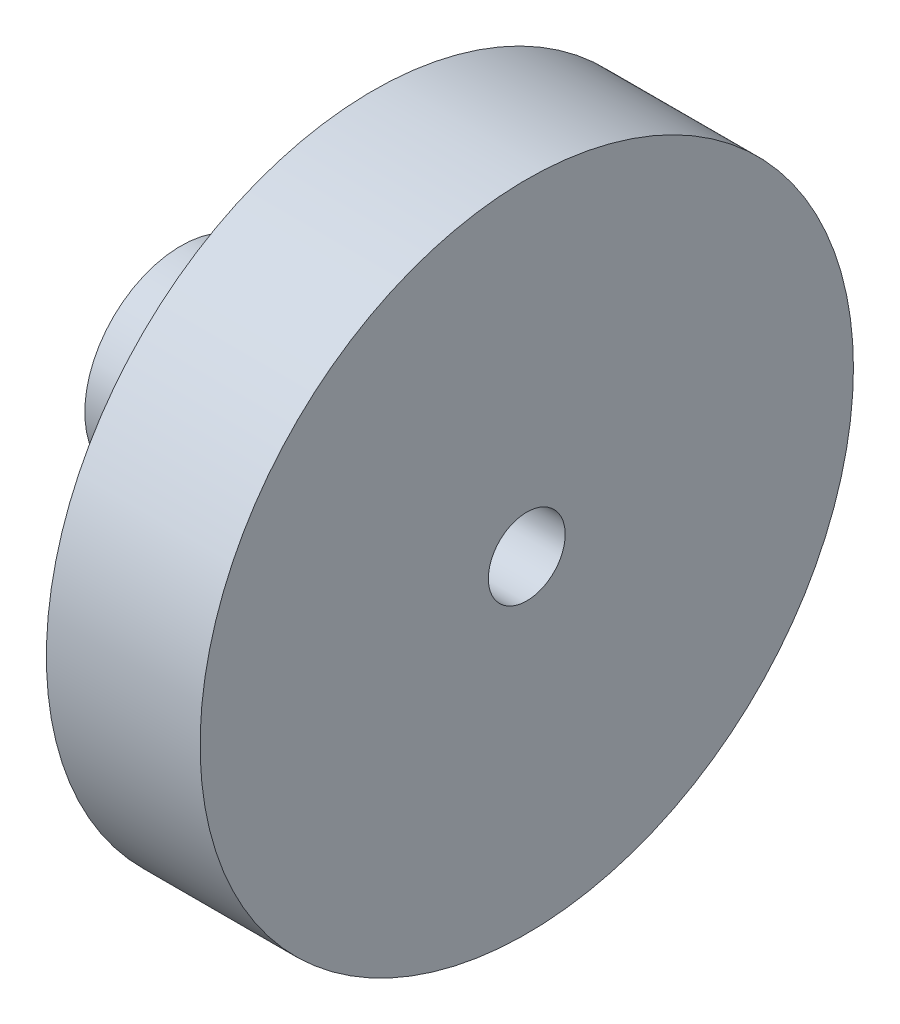
ISO-10303-21;
HEADER;
FILE_DESCRIPTION(('STEP AP214'),'2;1');
FILE_NAME('part.step','',(''),(''),'','','');
FILE_SCHEMA(('AUTOMOTIVE_DESIGN { 1 0 10303 214 1 1 1 1 }'));
ENDSEC;
DATA;
#1=APPLICATION_CONTEXT('core data for automotive mechanical design processes');
#2=APPLICATION_PROTOCOL_DEFINITION('international standard','automotive_design',2000,#1);
#3=PRODUCT_CONTEXT('',#1,'mechanical');
#4=PRODUCT('Part','Part','',(#3));
#5=PRODUCT_RELATED_PRODUCT_CATEGORY('part','',(#4));
#6=PRODUCT_DEFINITION_FORMATION('','',#4);
#7=PRODUCT_DEFINITION_CONTEXT('part definition',#1,'design');
#8=PRODUCT_DEFINITION('design','',#6,#7);
#9=PRODUCT_DEFINITION_SHAPE('','',#8);
#10=(LENGTH_UNIT() NAMED_UNIT(*) SI_UNIT(.MILLI.,.METRE.));
#11=(NAMED_UNIT(*) PLANE_ANGLE_UNIT() SI_UNIT($,.RADIAN.));
#12=(NAMED_UNIT(*) SI_UNIT($,.STERADIAN.) SOLID_ANGLE_UNIT());
#13=UNCERTAINTY_MEASURE_WITH_UNIT(LENGTH_MEASURE(1.E-05),#10,'distance_accuracy_value','');
#14=(GEOMETRIC_REPRESENTATION_CONTEXT(3) GLOBAL_UNCERTAINTY_ASSIGNED_CONTEXT((#13)) GLOBAL_UNIT_ASSIGNED_CONTEXT((#10,
#11,#12)) REPRESENTATION_CONTEXT('',''));
#15=CARTESIAN_POINT('',(0.,0.,0.));
#16=DIRECTION('',(0.,0.,1.));
#17=DIRECTION('',(1.,0.,0.));
#18=AXIS2_PLACEMENT_3D('',#15,#16,#17);
#19=CARTESIAN_POINT('',(0.,0.,0.));
#20=DIRECTION('',(1.,0.,0.));
#21=DIRECTION('',(0.,0.,-1.));
#22=AXIS2_PLACEMENT_3D('',#19,#20,#21);
#23=CYLINDRICAL_SURFACE('',#22,1.99999999999999);
#24=CARTESIAN_POINT('',(-13.45322017837,1.79843682124226,0.874999999999999));
#25=CARTESIAN_POINT('',(-13.4996455668491,1.79844267025872,0.874994185373086));
#26=CARTESIAN_POINT('',(-13.5461362263386,1.80026089575614,0.871281814553723));
#27=CARTESIAN_POINT('',(-13.6377609995906,1.80729814585877,0.856583265673776));
#28=CARTESIAN_POINT('',(-13.6828912938866,1.81252595391355,0.84557829993033));
#29=CARTESIAN_POINT('',(-13.7702976402033,1.8256650779135,0.816819377461344));
#30=CARTESIAN_POINT('',(-13.8125852056156,1.8335646755163,0.799094852047655));
#31=CARTESIAN_POINT('',(-13.8935757385446,1.85114060751144,0.757486974078159));
#32=CARTESIAN_POINT('',(-13.9322792980636,1.86081664768249,0.73360464113771));
#33=CARTESIAN_POINT('',(-14.0076858180357,1.88159814273405,0.67860444231314));
#34=CARTESIAN_POINT('',(-14.0441131990626,1.89275511820233,0.647128046535023));
#35=CARTESIAN_POINT('',(-14.1113783929879,1.91482009276172,0.578584404393027));
#36=CARTESIAN_POINT('',(-14.142213918134,1.92572798836067,0.54151488106822));
#37=CARTESIAN_POINT('',(-14.1988776130539,1.94670307260467,0.460623507148396));
#38=CARTESIAN_POINT('',(-14.2243889001395,1.95670347428988,0.41656077793032));
#39=CARTESIAN_POINT('',(-14.2675157518473,1.97409759337225,0.324251594935387));
#40=CARTESIAN_POINT('',(-14.2851351629206,1.98149258025648,0.276007192994719));
#41=CARTESIAN_POINT('',(-14.3109580815994,1.99247601660861,0.179604041111906));
#42=CARTESIAN_POINT('',(-14.319638658996,1.99625645567351,0.131595413599112));
#43=CARTESIAN_POINT('',(-14.3288859892659,2.00028676065695,0.0346643937267909));
#44=CARTESIAN_POINT('',(-14.3294563937463,2.00053821550072,-0.0142575774637081));
#45=CARTESIAN_POINT('',(-14.3227019762157,1.99759023252614,-0.108130873463996));
#46=CARTESIAN_POINT('',(-14.3159033487893,1.99462077737978,-0.153128695211823));
#47=CARTESIAN_POINT('',(-14.295515053418,1.98588800112158,-0.241269408956307));
#48=CARTESIAN_POINT('',(-14.2819248829422,1.98012447326713,-0.284412163433232));
#49=CARTESIAN_POINT('',(-14.2481883972403,1.96624268291741,-0.368417631333126));
#50=CARTESIAN_POINT('',(-14.2279450345039,1.95808977061224,-0.409235407844303));
#51=CARTESIAN_POINT('',(-14.1815782919894,1.94021222057016,-0.487002053634942));
#52=CARTESIAN_POINT('',(-14.1554527802275,1.93048701331643,-0.523949512986161));
#53=CARTESIAN_POINT('',(-14.095743534564,1.90954741359336,-0.595935871549107));
#54=CARTESIAN_POINT('',(-14.0617419102102,1.89827601276047,-0.630612038356138));
#55=CARTESIAN_POINT('',(-13.9884073903243,1.87605441136165,-0.693936886024361));
#56=CARTESIAN_POINT('',(-13.9490720130834,1.86510436321814,-0.722582745149668));
#57=CARTESIAN_POINT('',(-13.8642488780768,1.84433360774734,-0.774104007572307));
#58=CARTESIAN_POINT('',(-13.8185799874721,1.83457425910816,-0.796708133338992));
#59=CARTESIAN_POINT('',(-13.7235451295974,1.81804057215013,-0.833753424928245));
#60=CARTESIAN_POINT('',(-13.6741821543204,1.81126384804948,-0.848201117652945));
#61=CARTESIAN_POINT('',(-13.5768048279816,1.8020725724064,-0.86754954409033));
#62=CARTESIAN_POINT('',(-13.5289342267471,1.79938817756936,-0.873042695282303));
#63=CARTESIAN_POINT('',(-13.4328901766476,1.79791183626622,-0.876080687797387));
#64=CARTESIAN_POINT('',(-13.3847168599139,1.79911829529383,-0.873628785071821));
#65=CARTESIAN_POINT('',(-13.2931886211794,1.80500670942424,-0.861388170364229));
#66=CARTESIAN_POINT('',(-13.249740356961,1.80942578993547,-0.85215387305427));
#67=CARTESIAN_POINT('',(-13.1650554737938,1.82089297578771,-0.827365600067959));
#68=CARTESIAN_POINT('',(-13.1238194113395,1.82794173912936,-0.81181004259548));
#69=CARTESIAN_POINT('',(-13.0426847429497,1.84425139082008,-0.774064553531829));
#70=CARTESIAN_POINT('',(-13.0029259532811,1.85359632906455,-0.751611624558049));
#71=CARTESIAN_POINT('',(-12.9275374391374,1.87333686493426,-0.700961597965227));
#72=CARTESIAN_POINT('',(-12.8919096333482,1.88373294661273,-0.67276184779974));
#73=CARTESIAN_POINT('',(-12.8223972844785,1.9055511022817,-0.608384071274641));
#74=CARTESIAN_POINT('',(-12.7889703773977,1.91698003267099,-0.571712181701362));
#75=CARTESIAN_POINT('',(-12.7286480364516,1.93870750509733,-0.493028918701698));
#76=CARTESIAN_POINT('',(-12.7017534029818,1.94900590852694,-0.451016891911296));
#77=CARTESIAN_POINT('',(-12.6551778658299,1.96743104077039,-0.36232293883673));
#78=CARTESIAN_POINT('',(-12.6355478993033,1.97554233072842,-0.315610854101785));
#79=CARTESIAN_POINT('',(-12.6045830029,1.98855746644758,-0.219097297225345));
#80=CARTESIAN_POINT('',(-12.5932425737112,1.99346343839954,-0.169297897056046));
#81=CARTESIAN_POINT('',(-12.5799216972897,1.9992481211277,-0.07209118045084));
#82=CARTESIAN_POINT('',(-12.5772979505768,2.00040346809815,-0.0247879798759334));
#83=CARTESIAN_POINT('',(-12.5797156890887,1.99934575386789,0.0695781809476551));
#84=CARTESIAN_POINT('',(-12.5847555731484,1.99713339628286,0.116641189318635));
#85=CARTESIAN_POINT('',(-12.6018970800604,1.98974125718853,0.207139588656076));
#86=CARTESIAN_POINT('',(-12.6136929883777,1.98469010746016,0.250644310304771));
#87=CARTESIAN_POINT('',(-12.6436605807471,1.97220099963069,0.335028608079217));
#88=CARTESIAN_POINT('',(-12.66183340789,1.96476261362741,0.375907711996158));
#89=CARTESIAN_POINT('',(-12.7049588556092,1.94778329676525,0.455950413510898));
#90=CARTESIAN_POINT('',(-12.7301838494413,1.93816167830775,0.494949713940653));
#91=CARTESIAN_POINT('',(-12.7863173209961,1.9179284324557,0.568332496894421));
#92=CARTESIAN_POINT('',(-12.8172281396271,1.90731639818727,0.602714068131048));
#93=CARTESIAN_POINT('',(-12.8866180691496,1.8852720278619,0.668615771310957));
#94=CARTESIAN_POINT('',(-12.92549407957,1.87383871323809,0.699719139890721));
#95=CARTESIAN_POINT('',(-13.008235966694,1.85224037393765,0.755043607534097));
#96=CARTESIAN_POINT('',(-13.0521048360146,1.84207611764286,0.779260548271213));
#97=CARTESIAN_POINT('',(-13.1438407753336,1.82429849284974,0.820019671710732));
#98=CARTESIAN_POINT('',(-13.1917127591117,1.81668831862308,0.836552253811327));
#99=CARTESIAN_POINT('',(-13.2899205481475,1.80518424635639,0.861104681242927));
#100=CARTESIAN_POINT('',(-13.3402474868291,1.80127788482797,0.869153086488734));
#101=CARTESIAN_POINT('',(-13.4116225729651,1.79879556732175,0.874260805643789));
#102=CARTESIAN_POINT('',(-13.4324148213181,1.79843420002831,0.875002605802406));
#103=CARTESIAN_POINT('',(-13.45322017837,1.79843682124226,0.874999999999999));
#104=B_SPLINE_CURVE_WITH_KNOTS('',3,(#24,#25,#26,#27,#28,#29,#30,#31,#32,#33,#34,#35,#36,#37,
#38,#39,#40,#41,#42,#43,#44,#45,#46,#47,#48,#49,#50,#51,#52,#53,#54,#55,#56,#57,#58,#59,#60,#61,
#62,#63,#64,#65,#66,#67,#68,#69,#70,#71,#72,#73,#74,#75,#76,#77,#78,#79,#80,#81,#82,#83,#84,#85,
#86,#87,#88,#89,#90,#91,#92,#93,#94,#95,#96,#97,#98,#99,#100,#101,#102,#103),.UNSPECIFIED.,.T.,
.F.,(4,2,2,2,2,2,2,2,2,2,2,2,2,2,2,2,2,2,2,2,2,2,2,2,2,2,2,2,2,2,2,2,2,2,2,2,2,2,2,4),(0.,
0.139211854544829,0.278783757833573,0.417751277057172,0.556695800673241,0.704311269509711,
0.851986995525496,1.00685254156655,1.16164252475057,1.30765941027075,1.45361054957448,
1.58978716337857,1.72597385487562,1.86424242444373,2.00256119034027,2.1514705177321,
2.30044936949917,2.45528783220658,2.61000221454627,2.75399082716966,2.89792043948698,
3.03123544972419,3.16458384051276,3.30382998316913,3.44314054349794,3.5951953656407,
3.74726880958002,3.90038919363012,4.0534079045894,4.19484840308351,4.33625935442152,
4.47172667892147,4.60721829895103,4.74891487272681,4.8906699154392,5.04321071182055,
5.19584342435713,5.34866632230719,5.50097312018721,5.56336037066704),.UNSPECIFIED.);
#105=CARTESIAN_POINT('',(-13.45322017837,1.79843682124226,0.874999999999999));
#106=VERTEX_POINT('',#105);
#107=EDGE_CURVE('E63',#106,#106,#104,.T.);
#108=ORIENTED_EDGE('',*,*,#107,.F.);
#109=EDGE_LOOP('',(#108));
#110=FACE_BOUND('',#109,.T.);
#111=CARTESIAN_POINT('',(0.,0.,0.));
#112=DIRECTION('',(1.,0.,0.));
#113=DIRECTION('',(0.,0.,-1.));
#114=AXIS2_PLACEMENT_3D('',#111,#112,#113);
#115=CIRCLE('',#114,1.99999999999999);
#116=CARTESIAN_POINT('',(0.,0.,-1.99999999999999));
#117=VERTEX_POINT('',#116);
#118=EDGE_CURVE('E53',#117,#117,#115,.T.);
#119=ORIENTED_EDGE('',*,*,#118,.T.);
#120=EDGE_LOOP('',(#119));
#121=FACE_BOUND('',#120,.T.);
#122=CARTESIAN_POINT('',(-18.,0.,0.));
#123=DIRECTION('',(1.,0.,0.));
#124=DIRECTION('',(0.,0.,-1.));
#125=AXIS2_PLACEMENT_3D('',#122,#123,#124);
#126=CIRCLE('',#125,1.99999999999999);
#127=CARTESIAN_POINT('',(-18.,0.,-1.99999999999999));
#128=VERTEX_POINT('',#127);
#129=EDGE_CURVE('E10',#128,#128,#126,.T.);
#130=ORIENTED_EDGE('',*,*,#129,.F.);
#131=EDGE_LOOP('',(#130));
#132=FACE_BOUND('',#131,.T.);
#133=ADVANCED_FACE('F31',(#110,#121,#132),#23,.F.);
#134=CARTESIAN_POINT('',(-18.,5.,0.));
#135=DIRECTION('',(-1.,0.,0.));
#136=DIRECTION('',(0.,0.,1.));
#137=AXIS2_PLACEMENT_3D('',#134,#135,#136);
#138=PLANE('',#137);
#139=ORIENTED_EDGE('',*,*,#129,.T.);
#140=EDGE_LOOP('',(#139));
#141=FACE_BOUND('',#140,.T.);
#142=CARTESIAN_POINT('',(-18.,0.,0.));
#143=DIRECTION('',(1.,0.,0.));
#144=DIRECTION('',(0.,0.,-1.));
#145=AXIS2_PLACEMENT_3D('',#142,#143,#144);
#146=CIRCLE('',#145,5.);
#147=CARTESIAN_POINT('',(-18.,0.,-5.));
#148=VERTEX_POINT('',#147);
#149=EDGE_CURVE('E37',#148,#148,#146,.T.);
#150=ORIENTED_EDGE('',*,*,#149,.F.);
#151=EDGE_LOOP('',(#150));
#152=FACE_BOUND('',#151,.T.);
#153=ADVANCED_FACE('F90',(#141,#152),#138,.T.);
#154=CARTESIAN_POINT('',(0.,0.,0.));
#155=DIRECTION('',(1.,0.,0.));
#156=DIRECTION('',(0.,0.,-1.));
#157=AXIS2_PLACEMENT_3D('',#154,#155,#156);
#158=CYLINDRICAL_SURFACE('',#157,5.);
#159=CARTESIAN_POINT('',(-13.45322017837,4.9228421668788,0.874999999999999));
#160=CARTESIAN_POINT('',(-13.4044765120783,4.92284307499697,0.874998073539557));
#161=CARTESIAN_POINT('',(-13.3557071366336,4.92357397476884,0.870913147606656));
#162=CARTESIAN_POINT('',(-13.25953938974,4.92641556128211,0.854689981459766));
#163=CARTESIAN_POINT('',(-13.2121422829829,4.92852748100301,0.842544544648483));
#164=CARTESIAN_POINT('',(-13.1201246317655,4.93388475646331,0.810581240433705));
#165=CARTESIAN_POINT('',(-13.0755017036428,4.93712912285695,0.790770068454977));
#166=CARTESIAN_POINT('',(-12.990217100068,4.94438456334799,0.744054765254319));
#167=CARTESIAN_POINT('',(-12.9495550324841,4.94839556143087,0.717151337156948));
#168=CARTESIAN_POINT('',(-12.872900850826,4.95678097185183,0.656703779310403));
#169=CARTESIAN_POINT('',(-12.8369579756245,4.96115853789756,0.623097637866167));
#170=CARTESIAN_POINT('',(-12.7711906584155,4.96975589120863,0.550332633939766));
#171=CARTESIAN_POINT('',(-12.7413665937748,4.97397566872952,0.51117342923396));
#172=CARTESIAN_POINT('',(-12.6884971547799,4.98181553132084,0.428093104045913));
#173=CARTESIAN_POINT('',(-12.6654978435704,4.98543147235489,0.384142246104396));
#174=CARTESIAN_POINT('',(-12.627227119512,4.99162106697564,0.292926899802081));
#175=CARTESIAN_POINT('',(-12.6119551530828,4.99419479522293,0.245662649086159));
#176=CARTESIAN_POINT('',(-12.5897238897306,4.99798770637486,0.149671533158271));
#177=CARTESIAN_POINT('',(-12.5826817462932,4.9992203802933,0.100964396772047));
#178=CARTESIAN_POINT('',(-12.5768522109989,5.00023870350343,0.00304537017441892));
#179=CARTESIAN_POINT('',(-12.5780642031927,5.00002446076855,-0.0461664820998754));
#180=CARTESIAN_POINT('',(-12.5886443402899,4.99818371661764,-0.143130893939201));
#181=CARTESIAN_POINT('',(-12.5979233089294,4.99657265682183,-0.190893519071767));
#182=CARTESIAN_POINT('',(-12.6242333433602,4.99213654894816,-0.284173216176665));
#183=CARTESIAN_POINT('',(-12.6412646637993,4.9893114609923,-0.329690214330628));
#184=CARTESIAN_POINT('',(-12.6826831500164,4.98273861194286,-0.417449271832483));
#185=CARTESIAN_POINT('',(-12.7071066358228,4.9789863122702,-0.459673835906608));
#186=CARTESIAN_POINT('',(-12.7625894937887,4.9709751939494,-0.539458800879953));
#187=CARTESIAN_POINT('',(-12.793649456538,4.96671633023635,-0.577018786200772));
#188=CARTESIAN_POINT('',(-12.8620169805182,4.9580977872857,-0.646935876894303));
#189=CARTESIAN_POINT('',(-12.8994025162358,4.95373752143685,-0.679216709920823));
#190=CARTESIAN_POINT('',(-12.9790983816665,4.9454624226339,-0.737060264743535));
#191=CARTESIAN_POINT('',(-13.0214087663049,4.9415475946486,-0.762622911603708));
#192=CARTESIAN_POINT('',(-13.1098466262571,4.9346060965737,-0.806322044336454));
#193=CARTESIAN_POINT('',(-13.1559790999631,4.93158061381118,-0.824448615268406));
#194=CARTESIAN_POINT('',(-13.2506991598437,4.92677939981509,-0.852673278505629));
#195=CARTESIAN_POINT('',(-13.299286505656,4.92500354648059,-0.862772155207125));
#196=CARTESIAN_POINT('',(-13.3968525932563,4.92292649963477,-0.874545835364773));
#197=CARTESIAN_POINT('',(-13.4458177810996,4.92260621694777,-0.876329694679995));
#198=CARTESIAN_POINT('',(-13.5433467752425,4.92342563856456,-0.871713985213453));
#199=CARTESIAN_POINT('',(-13.5919105986211,4.92456528041931,-0.865314766467179));
#200=CARTESIAN_POINT('',(-13.6869072328927,4.92815844955311,-0.844607784274871));
#201=CARTESIAN_POINT('',(-13.7333526675969,4.93060264449508,-0.830356171120177));
#202=CARTESIAN_POINT('',(-13.8231961777391,4.93652160979565,-0.794408105046443));
#203=CARTESIAN_POINT('',(-13.866594054038,4.93999644742304,-0.772711166165632));
#204=CARTESIAN_POINT('',(-13.9495940049624,4.94762918558854,-0.722233434260734));
#205=CARTESIAN_POINT('',(-13.9891531962878,4.95179364615566,-0.693383138862326));
#206=CARTESIAN_POINT('',(-14.0629081337998,4.96031750209385,-0.629512391964065));
#207=CARTESIAN_POINT('',(-14.0971034620383,4.9646769126213,-0.594491460103899));
#208=CARTESIAN_POINT('',(-14.1595617733834,4.97316022831522,-0.518788866666416));
#209=CARTESIAN_POINT('',(-14.1877517875148,4.97728083740703,-0.478046575925644));
#210=CARTESIAN_POINT('',(-14.236886661375,4.98476842205262,-0.392341011884007));
#211=CARTESIAN_POINT('',(-14.2578317735038,4.98813542385933,-0.347377885699143));
#212=CARTESIAN_POINT('',(-14.2917703974613,4.99372215663664,-0.254717878442439));
#213=CARTESIAN_POINT('',(-14.3048011813031,4.99594725750524,-0.207034986784646));
#214=CARTESIAN_POINT('',(-14.3226608843745,4.99902226336019,-0.110115257508317));
#215=CARTESIAN_POINT('',(-14.3274905507923,4.99987229362628,-0.0608785618702644));
#216=CARTESIAN_POINT('',(-14.3287876723117,5.00009933383322,0.0370486139692459));
#217=CARTESIAN_POINT('',(-14.3253658303017,4.99949584443935,0.0857376177642916));
#218=CARTESIAN_POINT('',(-14.3104976775174,4.99692373636934,0.181835857215835));
#219=CARTESIAN_POINT('',(-14.2990514233488,4.99495512732298,0.229245101897529));
#220=CARTESIAN_POINT('',(-14.2685034917997,4.98987344263051,0.321389465944212));
#221=CARTESIAN_POINT('',(-14.2494121506771,4.98676191269648,0.3661281025404));
#222=CARTESIAN_POINT('',(-14.2041286462827,4.97973294623664,0.451784012491346));
#223=CARTESIAN_POINT('',(-14.1779360914348,4.97581546527185,0.492701074949028));
#224=CARTESIAN_POINT('',(-14.1188055841519,4.96754602270754,0.570107756976131));
#225=CARTESIAN_POINT('',(-14.0857869707684,4.96318921812377,0.606535249660261));
#226=CARTESIAN_POINT('',(-14.0141102726311,4.95456452663817,0.673371254635438));
#227=CARTESIAN_POINT('',(-13.9754508679116,4.95029666081621,0.703778354196428));
#228=CARTESIAN_POINT('',(-13.8932263349826,4.94229651148942,0.757933111841927));
#229=CARTESIAN_POINT('',(-13.8496248873744,4.93856872220172,0.781626301002854));
#230=CARTESIAN_POINT('',(-13.7590117440554,4.93212424297686,0.821314870424466));
#231=CARTESIAN_POINT('',(-13.7120034351501,4.92940656491337,0.837317778102986));
#232=CARTESIAN_POINT('',(-13.6295604452714,4.92587891597868,0.857781628925296));
#233=CARTESIAN_POINT('',(-13.5946189093884,4.92474663101162,0.864227890207769));
#234=CARTESIAN_POINT('',(-13.5241961783149,4.92322793379499,0.872837731365281));
#235=CARTESIAN_POINT('',(-13.4887149946826,4.92284150559315,0.875001402835787));
#236=CARTESIAN_POINT('',(-13.45322017837,4.9228421668788,0.874999999999999));
#237=B_SPLINE_CURVE_WITH_KNOTS('',3,(#159,#160,#161,#162,#163,#164,#165,#166,#167,#168,#169,
#170,#171,#172,#173,#174,#175,#176,#177,#178,#179,#180,#181,#182,#183,#184,#185,#186,#187,#188,
#189,#190,#191,#192,#193,#194,#195,#196,#197,#198,#199,#200,#201,#202,#203,#204,#205,#206,#207,
#208,#209,#210,#211,#212,#213,#214,#215,#216,#217,#218,#219,#220,#221,#222,#223,#224,#225,#226,
#227,#228,#229,#230,#231,#232,#233,#234,#235,#236),.UNSPECIFIED.,.T.,.F.,(4,2,2,2,2,2,2,2,2,2,2,
2,2,2,2,2,2,2,2,2,2,2,2,2,2,2,2,2,2,2,2,2,2,2,2,2,2,2,4),(0.,0.146101164953181,
0.292332947963994,0.438437296117103,0.584527164964141,0.732037167460386,0.879556264642579,
1.02804949490522,1.17653208573414,1.32350671966023,1.47047038600328,1.61582980987728,
1.76119400883468,1.90728435279678,2.05338770297162,2.20144435454404,2.34950265750048,
2.49775773829612,2.64599833111777,2.792289094643,2.93857360071282,3.08382539293052,
3.22908666764115,3.3758187701758,3.5225623002909,3.67099828718693,3.81942910230912,
3.96715535955237,4.11486815701679,4.26061027818323,4.40635137126931,4.55189608218353,
4.69744882037613,4.84483139209219,4.99224850734335,5.14082942553665,5.28926461170158,
5.39565679196015,5.50204669669217),.UNSPECIFIED.);
#238=CARTESIAN_POINT('',(-13.45322017837,4.9228421668788,0.874999999999999));
#239=VERTEX_POINT('',#238);
#240=EDGE_CURVE('E56',#239,#239,#237,.T.);
#241=ORIENTED_EDGE('',*,*,#240,.F.);
#242=EDGE_LOOP('',(#241));
#243=FACE_BOUND('',#242,.T.);
#244=ORIENTED_EDGE('',*,*,#149,.T.);
#245=EDGE_LOOP('',(#244));
#246=FACE_BOUND('',#245,.T.);
#247=CARTESIAN_POINT('',(-8.,0.,0.));
#248=DIRECTION('',(1.,0.,0.));
#249=DIRECTION('',(0.,0.,-1.));
#250=AXIS2_PLACEMENT_3D('',#247,#248,#249);
#251=CIRCLE('',#250,5.);
#252=CARTESIAN_POINT('',(-8.,0.,-5.));
#253=VERTEX_POINT('',#252);
#254=EDGE_CURVE('E41',#253,#253,#251,.T.);
#255=ORIENTED_EDGE('',*,*,#254,.F.);
#256=EDGE_LOOP('',(#255));
#257=FACE_BOUND('',#256,.T.);
#258=ADVANCED_FACE('F67',(#243,#246,#257),#158,.T.);
#259=CARTESIAN_POINT('',(-8.,17.,0.));
#260=DIRECTION('',(-1.,0.,0.));
#261=DIRECTION('',(0.,0.,1.));
#262=AXIS2_PLACEMENT_3D('',#259,#260,#261);
#263=PLANE('',#262);
#264=ORIENTED_EDGE('',*,*,#254,.T.);
#265=EDGE_LOOP('',(#264));
#266=FACE_BOUND('',#265,.T.);
#267=CARTESIAN_POINT('',(-8.,0.,0.));
#268=DIRECTION('',(1.,0.,0.));
#269=DIRECTION('',(0.,0.,-1.));
#270=AXIS2_PLACEMENT_3D('',#267,#268,#269);
#271=CIRCLE('',#270,17.);
#272=CARTESIAN_POINT('',(-8.,0.,-17.));
#273=VERTEX_POINT('',#272);
#274=EDGE_CURVE('E45',#273,#273,#271,.T.);
#275=ORIENTED_EDGE('',*,*,#274,.F.);
#276=EDGE_LOOP('',(#275));
#277=FACE_BOUND('',#276,.T.);
#278=ADVANCED_FACE('F83',(#266,#277),#263,.T.);
#279=CARTESIAN_POINT('',(0.,0.,0.));
#280=DIRECTION('',(1.,0.,0.));
#281=DIRECTION('',(0.,0.,-1.));
#282=AXIS2_PLACEMENT_3D('',#279,#280,#281);
#283=CYLINDRICAL_SURFACE('',#282,17.);
#284=ORIENTED_EDGE('',*,*,#274,.T.);
#285=EDGE_LOOP('',(#284));
#286=FACE_BOUND('',#285,.T.);
#287=CARTESIAN_POINT('',(0.,0.,0.));
#288=DIRECTION('',(1.,0.,0.));
#289=DIRECTION('',(0.,0.,-1.));
#290=AXIS2_PLACEMENT_3D('',#287,#288,#289);
#291=CIRCLE('',#290,17.);
#292=CARTESIAN_POINT('',(0.,0.,-17.));
#293=VERTEX_POINT('',#292);
#294=EDGE_CURVE('E50',#293,#293,#291,.T.);
#295=ORIENTED_EDGE('',*,*,#294,.F.);
#296=EDGE_LOOP('',(#295));
#297=FACE_BOUND('',#296,.T.);
#298=ADVANCED_FACE('F80',(#286,#297),#283,.T.);
#299=CARTESIAN_POINT('',(0.,17.,0.));
#300=DIRECTION('',(1.,0.,0.));
#301=DIRECTION('',(0.,0.,-1.));
#302=AXIS2_PLACEMENT_3D('',#299,#300,#301);
#303=PLANE('',#302);
#304=ORIENTED_EDGE('',*,*,#294,.T.);
#305=EDGE_LOOP('',(#304));
#306=FACE_BOUND('',#305,.T.);
#307=ORIENTED_EDGE('',*,*,#118,.F.);
#308=EDGE_LOOP('',(#307));
#309=FACE_BOUND('',#308,.T.);
#310=ADVANCED_FACE('F73',(#306,#309),#303,.T.);
#311=CARTESIAN_POINT('',(-13.45322017837,5.,0.));
#312=DIRECTION('',(0.,1.,0.));
#313=DIRECTION('',(0.,0.,1.));
#314=AXIS2_PLACEMENT_3D('',#311,#312,#313);
#315=CYLINDRICAL_SURFACE('',#314,0.874999999999999);
#316=ORIENTED_EDGE('',*,*,#240,.T.);
#317=EDGE_LOOP('',(#316));
#318=FACE_BOUND('',#317,.T.);
#319=ORIENTED_EDGE('',*,*,#107,.T.);
#320=EDGE_LOOP('',(#319));
#321=FACE_BOUND('',#320,.T.);
#322=ADVANCED_FACE('F70',(#318,#321),#315,.F.);
#323=CLOSED_SHELL('',(#133,#153,#258,#278,#298,#310,#322));
#324=MANIFOLD_SOLID_BREP('B2',#323);
#325=ADVANCED_BREP_SHAPE_REPRESENTATION('',(#18,#324),#14);
#326=SHAPE_DEFINITION_REPRESENTATION(#9,#325);
ENDSEC;
END-ISO-10303-21;
